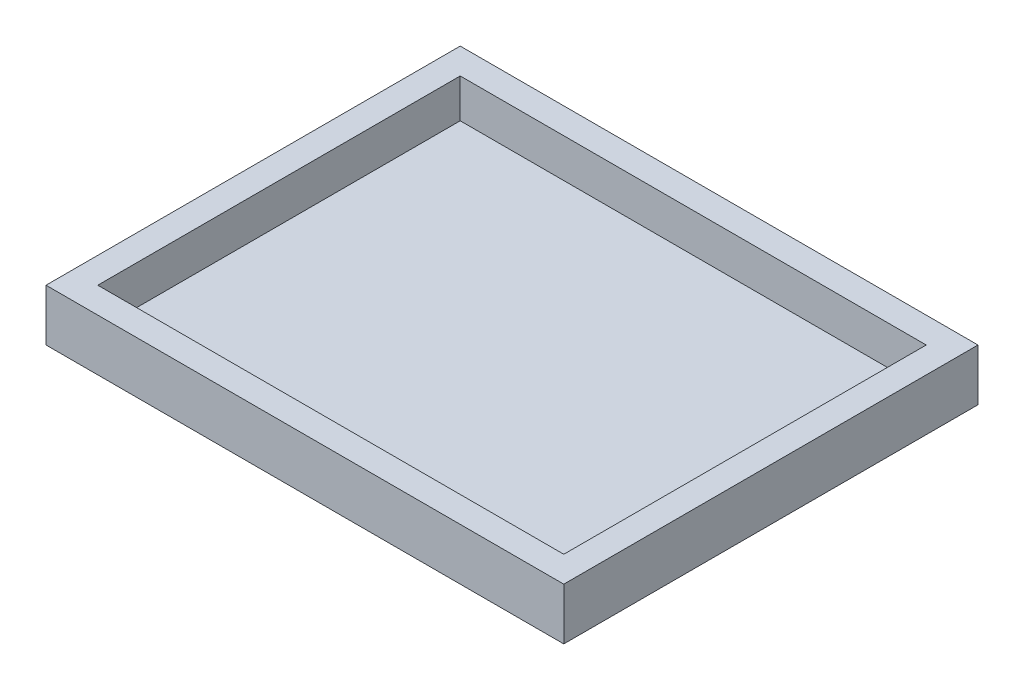
ISO-10303-21;
HEADER;
FILE_DESCRIPTION(('STEP AP214'),'2;1');
FILE_NAME('part.step','',(''),(''),'','','');
FILE_SCHEMA(('AUTOMOTIVE_DESIGN { 1 0 10303 214 1 1 1 1 }'));
ENDSEC;
DATA;
#1=APPLICATION_CONTEXT('core data for automotive mechanical design processes');
#2=APPLICATION_PROTOCOL_DEFINITION('international standard','automotive_design',2000,#1);
#3=PRODUCT_CONTEXT('',#1,'mechanical');
#4=PRODUCT('Part','Part','',(#3));
#5=PRODUCT_RELATED_PRODUCT_CATEGORY('part','',(#4));
#6=PRODUCT_DEFINITION_FORMATION('','',#4);
#7=PRODUCT_DEFINITION_CONTEXT('part definition',#1,'design');
#8=PRODUCT_DEFINITION('design','',#6,#7);
#9=PRODUCT_DEFINITION_SHAPE('','',#8);
#10=(LENGTH_UNIT() NAMED_UNIT(*) SI_UNIT(.MILLI.,.METRE.));
#11=(NAMED_UNIT(*) PLANE_ANGLE_UNIT() SI_UNIT($,.RADIAN.));
#12=(NAMED_UNIT(*) SI_UNIT($,.STERADIAN.) SOLID_ANGLE_UNIT());
#13=UNCERTAINTY_MEASURE_WITH_UNIT(LENGTH_MEASURE(1.E-05),#10,'distance_accuracy_value','');
#14=(GEOMETRIC_REPRESENTATION_CONTEXT(3) GLOBAL_UNCERTAINTY_ASSIGNED_CONTEXT((#13)) GLOBAL_UNIT_ASSIGNED_CONTEXT((#10,
#11,#12)) REPRESENTATION_CONTEXT('',''));
#15=CARTESIAN_POINT('',(0.,0.,0.));
#16=DIRECTION('',(0.,0.,1.));
#17=DIRECTION('',(1.,0.,0.));
#18=AXIS2_PLACEMENT_3D('',#15,#16,#17);
#19=CARTESIAN_POINT('',(0.,10.,0.));
#20=DIRECTION('',(0.,1.,0.));
#21=DIRECTION('',(0.,0.,1.));
#22=AXIS2_PLACEMENT_3D('',#19,#20,#21);
#23=PLANE('',#22);
#24=DIRECTION('',(0.,0.,-1.));
#25=VECTOR('',#24,1.);
#26=CARTESIAN_POINT('',(50.,10.,-40.));
#27=LINE('',#26,#25);
#28=CARTESIAN_POINT('',(50.,10.,40.));
#29=VERTEX_POINT('',#28);
#30=CARTESIAN_POINT('',(50.,10.,-40.));
#31=VERTEX_POINT('',#30);
#32=EDGE_CURVE('E161',#29,#31,#27,.T.);
#33=ORIENTED_EDGE('',*,*,#32,.T.);
#34=DIRECTION('',(-1.,0.,0.));
#35=VECTOR('',#34,1.);
#36=CARTESIAN_POINT('',(-50.,10.,-40.));
#37=LINE('',#36,#35);
#38=CARTESIAN_POINT('',(-50.,10.,-40.));
#39=VERTEX_POINT('',#38);
#40=EDGE_CURVE('E165',#31,#39,#37,.T.);
#41=ORIENTED_EDGE('',*,*,#40,.T.);
#42=DIRECTION('',(0.,0.,1.));
#43=VECTOR('',#42,1.);
#44=CARTESIAN_POINT('',(-50.,10.,-40.));
#45=LINE('',#44,#43);
#46=CARTESIAN_POINT('',(-50.,10.,40.));
#47=VERTEX_POINT('',#46);
#48=EDGE_CURVE('E169',#39,#47,#45,.T.);
#49=ORIENTED_EDGE('',*,*,#48,.T.);
#50=DIRECTION('',(1.,0.,0.));
#51=VECTOR('',#50,1.);
#52=CARTESIAN_POINT('',(-50.,10.,40.));
#53=LINE('',#52,#51);
#54=EDGE_CURVE('E172',#47,#29,#53,.T.);
#55=ORIENTED_EDGE('',*,*,#54,.T.);
#56=EDGE_LOOP('',(#33,#41,#49,#55));
#57=FACE_BOUND('',#56,.T.);
#58=DIRECTION('',(0.,0.,1.));
#59=VECTOR('',#58,1.);
#60=CARTESIAN_POINT('',(-45.,10.,-35.));
#61=LINE('',#60,#59);
#62=CARTESIAN_POINT('',(-45.,10.,-35.));
#63=VERTEX_POINT('',#62);
#64=CARTESIAN_POINT('',(-45.,10.,35.));
#65=VERTEX_POINT('',#64);
#66=EDGE_CURVE('E140',#63,#65,#61,.T.);
#67=ORIENTED_EDGE('',*,*,#66,.F.);
#68=DIRECTION('',(-1.,0.,0.));
#69=VECTOR('',#68,1.);
#70=CARTESIAN_POINT('',(-45.,10.,-35.));
#71=LINE('',#70,#69);
#72=CARTESIAN_POINT('',(45.,10.,-35.));
#73=VERTEX_POINT('',#72);
#74=EDGE_CURVE('E136',#73,#63,#71,.T.);
#75=ORIENTED_EDGE('',*,*,#74,.F.);
#76=DIRECTION('',(0.,0.,-1.));
#77=VECTOR('',#76,1.);
#78=CARTESIAN_POINT('',(45.,10.,-35.));
#79=LINE('',#78,#77);
#80=CARTESIAN_POINT('',(45.,10.,35.));
#81=VERTEX_POINT('',#80);
#82=EDGE_CURVE('E121',#81,#73,#79,.T.);
#83=ORIENTED_EDGE('',*,*,#82,.F.);
#84=DIRECTION('',(1.,0.,0.));
#85=VECTOR('',#84,1.);
#86=CARTESIAN_POINT('',(-45.,10.,35.));
#87=LINE('',#86,#85);
#88=EDGE_CURVE('E147',#65,#81,#87,.T.);
#89=ORIENTED_EDGE('',*,*,#88,.F.);
#90=EDGE_LOOP('',(#67,#75,#83,#89));
#91=FACE_BOUND('',#90,.T.);
#92=ADVANCED_FACE('F47',(#57,#91),#23,.T.);
#93=CARTESIAN_POINT('',(0.,0.,0.));
#94=DIRECTION('',(0.,1.,0.));
#95=DIRECTION('',(0.,0.,1.));
#96=AXIS2_PLACEMENT_3D('',#93,#94,#95);
#97=PLANE('',#96);
#98=DIRECTION('',(0.,0.,-1.));
#99=VECTOR('',#98,1.);
#100=CARTESIAN_POINT('',(50.,0.,-40.));
#101=LINE('',#100,#99);
#102=CARTESIAN_POINT('',(50.,0.,40.));
#103=VERTEX_POINT('',#102);
#104=CARTESIAN_POINT('',(50.,0.,-40.));
#105=VERTEX_POINT('',#104);
#106=EDGE_CURVE('E160',#103,#105,#101,.T.);
#107=ORIENTED_EDGE('',*,*,#106,.F.);
#108=DIRECTION('',(1.,0.,0.));
#109=VECTOR('',#108,1.);
#110=CARTESIAN_POINT('',(-50.,0.,40.));
#111=LINE('',#110,#109);
#112=CARTESIAN_POINT('',(-50.,0.,40.));
#113=VERTEX_POINT('',#112);
#114=EDGE_CURVE('E166',#113,#103,#111,.T.);
#115=ORIENTED_EDGE('',*,*,#114,.F.);
#116=DIRECTION('',(0.,0.,1.));
#117=VECTOR('',#116,1.);
#118=CARTESIAN_POINT('',(-50.,0.,-40.));
#119=LINE('',#118,#117);
#120=CARTESIAN_POINT('',(-50.,0.,-40.));
#121=VERTEX_POINT('',#120);
#122=EDGE_CURVE('E182',#121,#113,#119,.T.);
#123=ORIENTED_EDGE('',*,*,#122,.F.);
#124=DIRECTION('',(-1.,0.,0.));
#125=VECTOR('',#124,1.);
#126=CARTESIAN_POINT('',(-50.,0.,-40.));
#127=LINE('',#126,#125);
#128=EDGE_CURVE('E179',#105,#121,#127,.T.);
#129=ORIENTED_EDGE('',*,*,#128,.F.);
#130=EDGE_LOOP('',(#107,#115,#123,#129));
#131=FACE_BOUND('',#130,.T.);
#132=ADVANCED_FACE('F205',(#131),#97,.F.);
#133=CARTESIAN_POINT('',(50.,10.,-40.));
#134=DIRECTION('',(-1.,0.,0.));
#135=DIRECTION('',(0.,0.,1.));
#136=AXIS2_PLACEMENT_3D('',#133,#134,#135);
#137=PLANE('',#136);
#138=ORIENTED_EDGE('',*,*,#106,.T.);
#139=DIRECTION('',(0.,-1.,0.));
#140=VECTOR('',#139,1.);
#141=CARTESIAN_POINT('',(50.,10.,-40.));
#142=LINE('',#141,#140);
#143=EDGE_CURVE('E11',#31,#105,#142,.T.);
#144=ORIENTED_EDGE('',*,*,#143,.F.);
#145=ORIENTED_EDGE('',*,*,#32,.F.);
#146=DIRECTION('',(0.,-1.,0.));
#147=VECTOR('',#146,1.);
#148=CARTESIAN_POINT('',(50.,10.,40.));
#149=LINE('',#148,#147);
#150=EDGE_CURVE('E175',#29,#103,#149,.T.);
#151=ORIENTED_EDGE('',*,*,#150,.T.);
#152=EDGE_LOOP('',(#138,#144,#145,#151));
#153=FACE_BOUND('',#152,.T.);
#154=ADVANCED_FACE('F49',(#153),#137,.F.);
#155=CARTESIAN_POINT('',(-50.,10.,-40.));
#156=DIRECTION('',(0.,0.,1.));
#157=DIRECTION('',(1.,0.,0.));
#158=AXIS2_PLACEMENT_3D('',#155,#156,#157);
#159=PLANE('',#158);
#160=ORIENTED_EDGE('',*,*,#128,.T.);
#161=DIRECTION('',(0.,-1.,0.));
#162=VECTOR('',#161,1.);
#163=CARTESIAN_POINT('',(-50.,10.,-40.));
#164=LINE('',#163,#162);
#165=EDGE_CURVE('E56',#39,#121,#164,.T.);
#166=ORIENTED_EDGE('',*,*,#165,.F.);
#167=ORIENTED_EDGE('',*,*,#40,.F.);
#168=ORIENTED_EDGE('',*,*,#143,.T.);
#169=EDGE_LOOP('',(#160,#166,#167,#168));
#170=FACE_BOUND('',#169,.T.);
#171=ADVANCED_FACE('F215',(#170),#159,.F.);
#172=CARTESIAN_POINT('',(-50.,10.,-40.));
#173=DIRECTION('',(1.,0.,0.));
#174=DIRECTION('',(0.,0.,-1.));
#175=AXIS2_PLACEMENT_3D('',#172,#173,#174);
#176=PLANE('',#175);
#177=ORIENTED_EDGE('',*,*,#122,.T.);
#178=DIRECTION('',(0.,-1.,0.));
#179=VECTOR('',#178,1.);
#180=CARTESIAN_POINT('',(-50.,10.,40.));
#181=LINE('',#180,#179);
#182=EDGE_CURVE('E190',#47,#113,#181,.T.);
#183=ORIENTED_EDGE('',*,*,#182,.F.);
#184=ORIENTED_EDGE('',*,*,#48,.F.);
#185=ORIENTED_EDGE('',*,*,#165,.T.);
#186=EDGE_LOOP('',(#177,#183,#184,#185));
#187=FACE_BOUND('',#186,.T.);
#188=ADVANCED_FACE('F199',(#187),#176,.F.);
#189=CARTESIAN_POINT('',(-50.,10.,40.));
#190=DIRECTION('',(0.,0.,-1.));
#191=DIRECTION('',(-1.,0.,0.));
#192=AXIS2_PLACEMENT_3D('',#189,#190,#191);
#193=PLANE('',#192);
#194=ORIENTED_EDGE('',*,*,#114,.T.);
#195=ORIENTED_EDGE('',*,*,#150,.F.);
#196=ORIENTED_EDGE('',*,*,#54,.F.);
#197=ORIENTED_EDGE('',*,*,#182,.T.);
#198=EDGE_LOOP('',(#194,#195,#196,#197));
#199=FACE_BOUND('',#198,.T.);
#200=ADVANCED_FACE('F208',(#199),#193,.F.);
#201=CARTESIAN_POINT('',(-45.,10.,-35.));
#202=DIRECTION('',(0.,0.,1.));
#203=DIRECTION('',(1.,0.,0.));
#204=AXIS2_PLACEMENT_3D('',#201,#202,#203);
#205=PLANE('',#204);
#206=DIRECTION('',(1.,0.,0.));
#207=VECTOR('',#206,1.);
#208=CARTESIAN_POINT('',(0.,2.5,-35.));
#209=LINE('',#208,#207);
#210=CARTESIAN_POINT('',(-45.,2.5,-35.));
#211=VERTEX_POINT('',#210);
#212=CARTESIAN_POINT('',(45.,2.5,-35.));
#213=VERTEX_POINT('',#212);
#214=EDGE_CURVE('E128',#211,#213,#209,.T.);
#215=ORIENTED_EDGE('',*,*,#214,.T.);
#216=DIRECTION('',(0.,-1.,0.));
#217=VECTOR('',#216,1.);
#218=CARTESIAN_POINT('',(45.,10.,-35.));
#219=LINE('',#218,#217);
#220=EDGE_CURVE('E115',#73,#213,#219,.T.);
#221=ORIENTED_EDGE('',*,*,#220,.F.);
#222=ORIENTED_EDGE('',*,*,#74,.T.);
#223=DIRECTION('',(0.,-1.,0.));
#224=VECTOR('',#223,1.);
#225=CARTESIAN_POINT('',(-45.,10.,-35.));
#226=LINE('',#225,#224);
#227=EDGE_CURVE('E130',#63,#211,#226,.T.);
#228=ORIENTED_EDGE('',*,*,#227,.T.);
#229=EDGE_LOOP('',(#215,#221,#222,#228));
#230=FACE_BOUND('',#229,.T.);
#231=ADVANCED_FACE('F129',(#230),#205,.T.);
#232=CARTESIAN_POINT('',(-45.,10.,-35.));
#233=DIRECTION('',(1.,0.,0.));
#234=DIRECTION('',(0.,0.,-1.));
#235=AXIS2_PLACEMENT_3D('',#232,#233,#234);
#236=PLANE('',#235);
#237=DIRECTION('',(0.,0.,1.));
#238=VECTOR('',#237,1.);
#239=CARTESIAN_POINT('',(-45.,2.5,0.));
#240=LINE('',#239,#238);
#241=CARTESIAN_POINT('',(-45.,2.5,35.));
#242=VERTEX_POINT('',#241);
#243=EDGE_CURVE('E63',#211,#242,#240,.T.);
#244=ORIENTED_EDGE('',*,*,#243,.F.);
#245=ORIENTED_EDGE('',*,*,#227,.F.);
#246=ORIENTED_EDGE('',*,*,#66,.T.);
#247=DIRECTION('',(0.,-1.,0.));
#248=VECTOR('',#247,1.);
#249=CARTESIAN_POINT('',(-45.,10.,35.));
#250=LINE('',#249,#248);
#251=EDGE_CURVE('E155',#65,#242,#250,.T.);
#252=ORIENTED_EDGE('',*,*,#251,.T.);
#253=EDGE_LOOP('',(#244,#245,#246,#252));
#254=FACE_BOUND('',#253,.T.);
#255=ADVANCED_FACE('F235',(#254),#236,.T.);
#256=CARTESIAN_POINT('',(-45.,10.,35.));
#257=DIRECTION('',(0.,0.,-1.));
#258=DIRECTION('',(-1.,0.,0.));
#259=AXIS2_PLACEMENT_3D('',#256,#257,#258);
#260=PLANE('',#259);
#261=DIRECTION('',(1.,0.,0.));
#262=VECTOR('',#261,1.);
#263=CARTESIAN_POINT('',(0.,2.5,35.));
#264=LINE('',#263,#262);
#265=CARTESIAN_POINT('',(45.,2.5,35.));
#266=VERTEX_POINT('',#265);
#267=EDGE_CURVE('E71',#242,#266,#264,.T.);
#268=ORIENTED_EDGE('',*,*,#267,.F.);
#269=ORIENTED_EDGE('',*,*,#251,.F.);
#270=ORIENTED_EDGE('',*,*,#88,.T.);
#271=DIRECTION('',(0.,-1.,0.));
#272=VECTOR('',#271,1.);
#273=CARTESIAN_POINT('',(45.,10.,35.));
#274=LINE('',#273,#272);
#275=EDGE_CURVE('E125',#81,#266,#274,.T.);
#276=ORIENTED_EDGE('',*,*,#275,.T.);
#277=EDGE_LOOP('',(#268,#269,#270,#276));
#278=FACE_BOUND('',#277,.T.);
#279=ADVANCED_FACE('F239',(#278),#260,.T.);
#280=CARTESIAN_POINT('',(45.,10.,-35.));
#281=DIRECTION('',(-1.,0.,0.));
#282=DIRECTION('',(0.,0.,1.));
#283=AXIS2_PLACEMENT_3D('',#280,#281,#282);
#284=PLANE('',#283);
#285=DIRECTION('',(0.,0.,1.));
#286=VECTOR('',#285,1.);
#287=CARTESIAN_POINT('',(45.,2.5,0.));
#288=LINE('',#287,#286);
#289=EDGE_CURVE('E119',#213,#266,#288,.T.);
#290=ORIENTED_EDGE('',*,*,#289,.T.);
#291=ORIENTED_EDGE('',*,*,#275,.F.);
#292=ORIENTED_EDGE('',*,*,#82,.T.);
#293=ORIENTED_EDGE('',*,*,#220,.T.);
#294=EDGE_LOOP('',(#290,#291,#292,#293));
#295=FACE_BOUND('',#294,.T.);
#296=ADVANCED_FACE('F117',(#295),#284,.T.);
#297=CARTESIAN_POINT('',(0.,2.5,0.));
#298=DIRECTION('',(0.,1.,0.));
#299=DIRECTION('',(0.,0.,1.));
#300=AXIS2_PLACEMENT_3D('',#297,#298,#299);
#301=PLANE('',#300);
#302=ORIENTED_EDGE('',*,*,#214,.F.);
#303=ORIENTED_EDGE('',*,*,#243,.T.);
#304=ORIENTED_EDGE('',*,*,#267,.T.);
#305=ORIENTED_EDGE('',*,*,#289,.F.);
#306=EDGE_LOOP('',(#302,#303,#304,#305));
#307=FACE_BOUND('',#306,.T.);
#308=ADVANCED_FACE('F134',(#307),#301,.T.);
#309=CLOSED_SHELL('',(#92,#132,#154,#171,#188,#200,#231,#255,#279,#296,#308));
#310=MANIFOLD_SOLID_BREP('B2',#309);
#311=ADVANCED_BREP_SHAPE_REPRESENTATION('',(#18,#310),#14);
#312=SHAPE_DEFINITION_REPRESENTATION(#9,#311);
ENDSEC;
END-ISO-10303-21;
